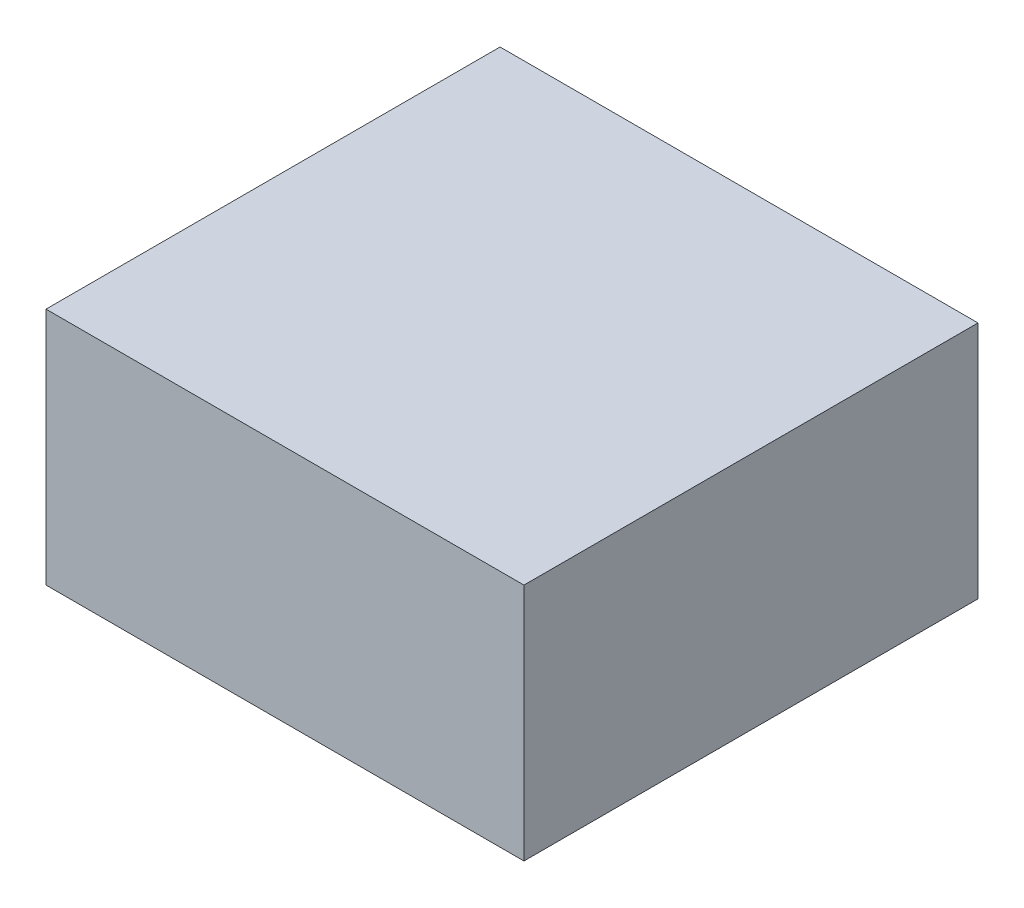
ISO-10303-21;
HEADER;
FILE_DESCRIPTION(('STEP AP214'),'2;1');
FILE_NAME('part.step','',(''),(''),'','','');
FILE_SCHEMA(('AUTOMOTIVE_DESIGN { 1 0 10303 214 1 1 1 1 }'));
ENDSEC;
DATA;
#1=APPLICATION_CONTEXT('core data for automotive mechanical design processes');
#2=APPLICATION_PROTOCOL_DEFINITION('international standard','automotive_design',2000,#1);
#3=PRODUCT_CONTEXT('',#1,'mechanical');
#4=PRODUCT('Part','Part','',(#3));
#5=PRODUCT_RELATED_PRODUCT_CATEGORY('part','',(#4));
#6=PRODUCT_DEFINITION_FORMATION('','',#4);
#7=PRODUCT_DEFINITION_CONTEXT('part definition',#1,'design');
#8=PRODUCT_DEFINITION('design','',#6,#7);
#9=PRODUCT_DEFINITION_SHAPE('','',#8);
#10=(LENGTH_UNIT() NAMED_UNIT(*) SI_UNIT(.MILLI.,.METRE.));
#11=(NAMED_UNIT(*) PLANE_ANGLE_UNIT() SI_UNIT($,.RADIAN.));
#12=(NAMED_UNIT(*) SI_UNIT($,.STERADIAN.) SOLID_ANGLE_UNIT());
#13=UNCERTAINTY_MEASURE_WITH_UNIT(LENGTH_MEASURE(1.E-05),#10,'distance_accuracy_value','');
#14=(GEOMETRIC_REPRESENTATION_CONTEXT(3) GLOBAL_UNCERTAINTY_ASSIGNED_CONTEXT((#13)) GLOBAL_UNIT_ASSIGNED_CONTEXT((#10,
#11,#12)) REPRESENTATION_CONTEXT('',''));
#15=CARTESIAN_POINT('',(0.,0.,0.));
#16=DIRECTION('',(0.,0.,1.));
#17=DIRECTION('',(1.,0.,0.));
#18=AXIS2_PLACEMENT_3D('',#15,#16,#17);
#19=CARTESIAN_POINT('',(-720.,0.5,-71.));
#20=DIRECTION('',(0.,0.,1.));
#21=DIRECTION('',(1.,0.,0.));
#22=AXIS2_PLACEMENT_3D('',#19,#20,#21);
#23=PLANE('',#22);
#24=DIRECTION('',(0.,1.,0.));
#25=VECTOR('',#24,1.);
#26=CARTESIAN_POINT('',(-720.,0.5,-71.));
#27=LINE('',#26,#25);
#28=CARTESIAN_POINT('',(-720.,0.5,-71.));
#29=VERTEX_POINT('',#28);
#30=CARTESIAN_POINT('',(-720.,20.5,-71.));
#31=VERTEX_POINT('',#30);
#32=EDGE_CURVE('E87',#29,#31,#27,.T.);
#33=ORIENTED_EDGE('',*,*,#32,.F.);
#34=DIRECTION('',(1.,0.,0.));
#35=VECTOR('',#34,1.);
#36=CARTESIAN_POINT('',(-720.,0.5,-71.));
#37=LINE('',#36,#35);
#38=CARTESIAN_POINT('',(-680.,0.5,-71.));
#39=VERTEX_POINT('',#38);
#40=EDGE_CURVE('E69',#29,#39,#37,.T.);
#41=ORIENTED_EDGE('',*,*,#40,.T.);
#42=DIRECTION('',(0.,1.,0.));
#43=VECTOR('',#42,1.);
#44=CARTESIAN_POINT('',(-680.,0.5,-71.));
#45=LINE('',#44,#43);
#46=CARTESIAN_POINT('',(-680.,20.5,-71.));
#47=VERTEX_POINT('',#46);
#48=EDGE_CURVE('E81',#39,#47,#45,.T.);
#49=ORIENTED_EDGE('',*,*,#48,.T.);
#50=DIRECTION('',(1.,0.,0.));
#51=VECTOR('',#50,1.);
#52=CARTESIAN_POINT('',(-720.,20.5,-71.));
#53=LINE('',#52,#51);
#54=EDGE_CURVE('E10',#31,#47,#53,.T.);
#55=ORIENTED_EDGE('',*,*,#54,.F.);
#56=EDGE_LOOP('',(#33,#41,#49,#55));
#57=FACE_BOUND('',#56,.T.);
#58=ADVANCED_FACE('F16',(#57),#23,.T.);
#59=CARTESIAN_POINT('',(-720.,0.5,-109.));
#60=DIRECTION('',(0.,0.,1.));
#61=DIRECTION('',(1.,0.,0.));
#62=AXIS2_PLACEMENT_3D('',#59,#60,#61);
#63=PLANE('',#62);
#64=DIRECTION('',(1.,0.,0.));
#65=VECTOR('',#64,1.);
#66=CARTESIAN_POINT('',(-720.,20.5,-109.));
#67=LINE('',#66,#65);
#68=CARTESIAN_POINT('',(-720.,20.5,-109.));
#69=VERTEX_POINT('',#68);
#70=CARTESIAN_POINT('',(-680.,20.5,-109.));
#71=VERTEX_POINT('',#70);
#72=EDGE_CURVE('E24',#69,#71,#67,.T.);
#73=ORIENTED_EDGE('',*,*,#72,.T.);
#74=DIRECTION('',(0.,1.,0.));
#75=VECTOR('',#74,1.);
#76=CARTESIAN_POINT('',(-680.,0.5,-109.));
#77=LINE('',#76,#75);
#78=CARTESIAN_POINT('',(-680.,0.5,-109.));
#79=VERTEX_POINT('',#78);
#80=EDGE_CURVE('E101',#79,#71,#77,.T.);
#81=ORIENTED_EDGE('',*,*,#80,.F.);
#82=DIRECTION('',(1.,0.,0.));
#83=VECTOR('',#82,1.);
#84=CARTESIAN_POINT('',(-720.,0.5,-109.));
#85=LINE('',#84,#83);
#86=CARTESIAN_POINT('',(-720.,0.5,-109.));
#87=VERTEX_POINT('',#86);
#88=EDGE_CURVE('E80',#87,#79,#85,.T.);
#89=ORIENTED_EDGE('',*,*,#88,.F.);
#90=DIRECTION('',(0.,1.,0.));
#91=VECTOR('',#90,1.);
#92=CARTESIAN_POINT('',(-720.,0.5,-109.));
#93=LINE('',#92,#91);
#94=EDGE_CURVE('E88',#87,#69,#93,.T.);
#95=ORIENTED_EDGE('',*,*,#94,.T.);
#96=EDGE_LOOP('',(#73,#81,#89,#95));
#97=FACE_BOUND('',#96,.T.);
#98=ADVANCED_FACE('F149',(#97),#63,.F.);
#99=CARTESIAN_POINT('',(-720.,20.5,-109.));
#100=DIRECTION('',(0.,1.,0.));
#101=DIRECTION('',(1.,0.,0.));
#102=AXIS2_PLACEMENT_3D('',#99,#100,#101);
#103=PLANE('',#102);
#104=ORIENTED_EDGE('',*,*,#72,.F.);
#105=DIRECTION('',(0.,0.,1.));
#106=VECTOR('',#105,1.);
#107=CARTESIAN_POINT('',(-720.,20.5,-109.));
#108=LINE('',#107,#106);
#109=EDGE_CURVE('E92',#69,#31,#108,.T.);
#110=ORIENTED_EDGE('',*,*,#109,.T.);
#111=ORIENTED_EDGE('',*,*,#54,.T.);
#112=DIRECTION('',(0.,0.,1.));
#113=VECTOR('',#112,1.);
#114=CARTESIAN_POINT('',(-680.,20.5,-109.));
#115=LINE('',#114,#113);
#116=EDGE_CURVE('E106',#71,#47,#115,.T.);
#117=ORIENTED_EDGE('',*,*,#116,.F.);
#118=EDGE_LOOP('',(#104,#110,#111,#117));
#119=FACE_BOUND('',#118,.T.);
#120=ADVANCED_FACE('F141',(#119),#103,.T.);
#121=CARTESIAN_POINT('',(-720.,0.5,-109.));
#122=DIRECTION('',(0.,1.,0.));
#123=DIRECTION('',(1.,0.,0.));
#124=AXIS2_PLACEMENT_3D('',#121,#122,#123);
#125=PLANE('',#124);
#126=DIRECTION('',(0.,0.,1.));
#127=VECTOR('',#126,1.);
#128=CARTESIAN_POINT('',(-680.,0.5,-109.));
#129=LINE('',#128,#127);
#130=EDGE_CURVE('E75',#79,#39,#129,.T.);
#131=ORIENTED_EDGE('',*,*,#130,.T.);
#132=ORIENTED_EDGE('',*,*,#40,.F.);
#133=DIRECTION('',(0.,0.,1.));
#134=VECTOR('',#133,1.);
#135=CARTESIAN_POINT('',(-720.,0.5,-109.));
#136=LINE('',#135,#134);
#137=EDGE_CURVE('E72',#87,#29,#136,.T.);
#138=ORIENTED_EDGE('',*,*,#137,.F.);
#139=ORIENTED_EDGE('',*,*,#88,.T.);
#140=EDGE_LOOP('',(#131,#132,#138,#139));
#141=FACE_BOUND('',#140,.T.);
#142=ADVANCED_FACE('F71',(#141),#125,.F.);
#143=CARTESIAN_POINT('',(-680.,0.5,-109.));
#144=DIRECTION('',(1.,0.,0.));
#145=DIRECTION('',(0.,1.,0.));
#146=AXIS2_PLACEMENT_3D('',#143,#144,#145);
#147=PLANE('',#146);
#148=ORIENTED_EDGE('',*,*,#130,.F.);
#149=ORIENTED_EDGE('',*,*,#80,.T.);
#150=ORIENTED_EDGE('',*,*,#116,.T.);
#151=ORIENTED_EDGE('',*,*,#48,.F.);
#152=EDGE_LOOP('',(#148,#149,#150,#151));
#153=FACE_BOUND('',#152,.T.);
#154=ADVANCED_FACE('F124',(#153),#147,.T.);
#155=CARTESIAN_POINT('',(-720.,0.5,-109.));
#156=DIRECTION('',(1.,0.,0.));
#157=DIRECTION('',(0.,1.,0.));
#158=AXIS2_PLACEMENT_3D('',#155,#156,#157);
#159=PLANE('',#158);
#160=ORIENTED_EDGE('',*,*,#32,.T.);
#161=ORIENTED_EDGE('',*,*,#109,.F.);
#162=ORIENTED_EDGE('',*,*,#94,.F.);
#163=ORIENTED_EDGE('',*,*,#137,.T.);
#164=EDGE_LOOP('',(#160,#161,#162,#163));
#165=FACE_BOUND('',#164,.T.);
#166=ADVANCED_FACE('F85',(#165),#159,.F.);
#167=CLOSED_SHELL('',(#58,#98,#120,#142,#154,#166));
#168=MANIFOLD_SOLID_BREP('B1',#167);
#169=ADVANCED_BREP_SHAPE_REPRESENTATION('',(#18,#168),#14);
#170=SHAPE_DEFINITION_REPRESENTATION(#9,#169);
ENDSEC;
END-ISO-10303-21;
